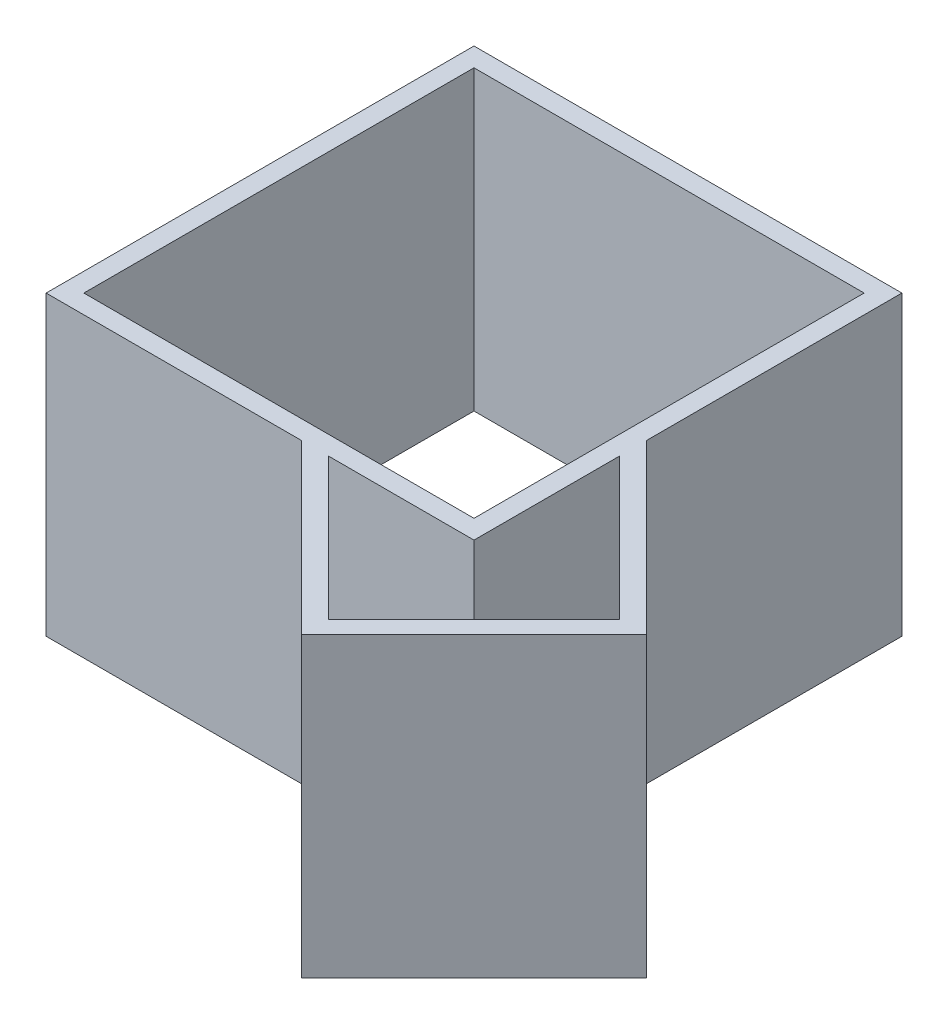
ISO-10303-21;
HEADER;
FILE_DESCRIPTION(('STEP AP214'),'2;1');
FILE_NAME('part.step','',(''),(''),'','','');
FILE_SCHEMA(('AUTOMOTIVE_DESIGN { 1 0 10303 214 1 1 1 1 }'));
ENDSEC;
DATA;
#1=APPLICATION_CONTEXT('core data for automotive mechanical design processes');
#2=APPLICATION_PROTOCOL_DEFINITION('international standard','automotive_design',2000,#1);
#3=PRODUCT_CONTEXT('',#1,'mechanical');
#4=PRODUCT('Part','Part','',(#3));
#5=PRODUCT_RELATED_PRODUCT_CATEGORY('part','',(#4));
#6=PRODUCT_DEFINITION_FORMATION('','',#4);
#7=PRODUCT_DEFINITION_CONTEXT('part definition',#1,'design');
#8=PRODUCT_DEFINITION('design','',#6,#7);
#9=PRODUCT_DEFINITION_SHAPE('','',#8);
#10=(LENGTH_UNIT() NAMED_UNIT(*) SI_UNIT(.MILLI.,.METRE.));
#11=(NAMED_UNIT(*) PLANE_ANGLE_UNIT() SI_UNIT($,.RADIAN.));
#12=(NAMED_UNIT(*) SI_UNIT($,.STERADIAN.) SOLID_ANGLE_UNIT());
#13=UNCERTAINTY_MEASURE_WITH_UNIT(LENGTH_MEASURE(1.E-05),#10,'distance_accuracy_value','');
#14=(GEOMETRIC_REPRESENTATION_CONTEXT(3) GLOBAL_UNCERTAINTY_ASSIGNED_CONTEXT((#13)) GLOBAL_UNIT_ASSIGNED_CONTEXT((#10,
#11,#12)) REPRESENTATION_CONTEXT('',''));
#15=CARTESIAN_POINT('',(0.,0.,0.));
#16=DIRECTION('',(0.,0.,1.));
#17=DIRECTION('',(1.,0.,0.));
#18=AXIS2_PLACEMENT_3D('',#15,#16,#17);
#19=CARTESIAN_POINT('',(35.985,25.,35.985));
#20=DIRECTION('',(-1.,0.,0.));
#21=DIRECTION('',(0.,0.,1.));
#22=AXIS2_PLACEMENT_3D('',#19,#20,#21);
#23=PLANE('',#22);
#24=DIRECTION('',(0.,-1.,0.));
#25=VECTOR('',#24,1.);
#26=CARTESIAN_POINT('',(35.985,25.,11.4837500318861));
#27=LINE('',#26,#25);
#28=CARTESIAN_POINT('',(35.985,25.,11.4837500318861));
#29=VERTEX_POINT('',#28);
#30=CARTESIAN_POINT('',(35.985,-25.,11.4837500318861));
#31=VERTEX_POINT('',#30);
#32=EDGE_CURVE('E55',#29,#31,#27,.T.);
#33=ORIENTED_EDGE('',*,*,#32,.F.);
#34=DIRECTION('',(0.,0.,-1.));
#35=VECTOR('',#34,1.);
#36=CARTESIAN_POINT('',(35.985,25.,35.985));
#37=LINE('',#36,#35);
#38=CARTESIAN_POINT('',(35.985,25.,35.985));
#39=VERTEX_POINT('',#38);
#40=EDGE_CURVE('E154',#39,#29,#37,.T.);
#41=ORIENTED_EDGE('',*,*,#40,.F.);
#42=DIRECTION('',(0.,-1.,0.));
#43=VECTOR('',#42,1.);
#44=CARTESIAN_POINT('',(35.985,25.,35.985));
#45=LINE('',#44,#43);
#46=CARTESIAN_POINT('',(35.985,-25.,35.985));
#47=VERTEX_POINT('',#46);
#48=EDGE_CURVE('E249',#39,#47,#45,.T.);
#49=ORIENTED_EDGE('',*,*,#48,.T.);
#50=DIRECTION('',(0.,0.,-1.));
#51=VECTOR('',#50,1.);
#52=CARTESIAN_POINT('',(35.985,-25.,35.985));
#53=LINE('',#52,#51);
#54=EDGE_CURVE('E250',#47,#31,#53,.T.);
#55=ORIENTED_EDGE('',*,*,#54,.T.);
#56=EDGE_LOOP('',(#33,#41,#49,#55));
#57=FACE_BOUND('',#56,.T.);
#58=ADVANCED_FACE('F33',(#57),#23,.F.);
#59=DIRECTION('',(0.,-1.,0.));
#60=VECTOR('',#59,1.);
#61=CARTESIAN_POINT('',(35.985,25.,6.99362197135155));
#62=LINE('',#61,#60);
#63=CARTESIAN_POINT('',(35.985,25.,6.99362197135155));
#64=VERTEX_POINT('',#63);
#65=CARTESIAN_POINT('',(35.985,-25.,6.99362197135155));
#66=VERTEX_POINT('',#65);
#67=EDGE_CURVE('E180',#64,#66,#62,.T.);
#68=ORIENTED_EDGE('',*,*,#67,.T.);
#69=CARTESIAN_POINT('',(35.985,-25.,-35.985));
#70=VERTEX_POINT('',#69);
#71=EDGE_CURVE('E239',#66,#70,#53,.T.);
#72=ORIENTED_EDGE('',*,*,#71,.T.);
#73=DIRECTION('',(0.,-1.,0.));
#74=VECTOR('',#73,1.);
#75=CARTESIAN_POINT('',(35.985,25.,-35.985));
#76=LINE('',#75,#74);
#77=CARTESIAN_POINT('',(35.985,25.,-35.985));
#78=VERTEX_POINT('',#77);
#79=EDGE_CURVE('E11',#78,#70,#76,.T.);
#80=ORIENTED_EDGE('',*,*,#79,.F.);
#81=EDGE_CURVE('E47',#64,#78,#37,.T.);
#82=ORIENTED_EDGE('',*,*,#81,.F.);
#83=EDGE_LOOP('',(#68,#72,#80,#82));
#84=FACE_BOUND('',#83,.T.);
#85=ADVANCED_FACE('F290',(#84),#23,.F.);
#86=CARTESIAN_POINT('',(-35.985,25.,35.985));
#87=DIRECTION('',(0.,0.,-1.));
#88=DIRECTION('',(-1.,0.,0.));
#89=AXIS2_PLACEMENT_3D('',#86,#87,#88);
#90=PLANE('',#89);
#91=DIRECTION('',(0.,-1.,0.));
#92=VECTOR('',#91,1.);
#93=CARTESIAN_POINT('',(11.4837500318861,25.,35.985));
#94=LINE('',#93,#92);
#95=CARTESIAN_POINT('',(11.4837500318861,25.,35.985));
#96=VERTEX_POINT('',#95);
#97=CARTESIAN_POINT('',(11.4837500318861,-25.,35.985));
#98=VERTEX_POINT('',#97);
#99=EDGE_CURVE('E203',#96,#98,#94,.T.);
#100=ORIENTED_EDGE('',*,*,#99,.T.);
#101=DIRECTION('',(1.,0.,0.));
#102=VECTOR('',#101,1.);
#103=CARTESIAN_POINT('',(-35.985,-25.,35.985));
#104=LINE('',#103,#102);
#105=EDGE_CURVE('E256',#98,#47,#104,.T.);
#106=ORIENTED_EDGE('',*,*,#105,.T.);
#107=ORIENTED_EDGE('',*,*,#48,.F.);
#108=DIRECTION('',(1.,0.,0.));
#109=VECTOR('',#108,1.);
#110=CARTESIAN_POINT('',(-35.985,25.,35.985));
#111=LINE('',#110,#109);
#112=EDGE_CURVE('E245',#96,#39,#111,.T.);
#113=ORIENTED_EDGE('',*,*,#112,.F.);
#114=EDGE_LOOP('',(#100,#106,#107,#113));
#115=FACE_BOUND('',#114,.T.);
#116=ADVANCED_FACE('F311',(#115),#90,.F.);
#117=DIRECTION('',(0.,-1.,0.));
#118=VECTOR('',#117,1.);
#119=CARTESIAN_POINT('',(6.99362197135154,25.,35.985));
#120=LINE('',#119,#118);
#121=CARTESIAN_POINT('',(6.99362197135155,25.,35.985));
#122=VERTEX_POINT('',#121);
#123=CARTESIAN_POINT('',(6.99362197135155,-25.,35.985));
#124=VERTEX_POINT('',#123);
#125=EDGE_CURVE('E200',#122,#124,#120,.T.);
#126=ORIENTED_EDGE('',*,*,#125,.F.);
#127=CARTESIAN_POINT('',(-35.985,25.,35.985));
#128=VERTEX_POINT('',#127);
#129=EDGE_CURVE('E246',#128,#122,#111,.T.);
#130=ORIENTED_EDGE('',*,*,#129,.F.);
#131=DIRECTION('',(0.,-1.,0.));
#132=VECTOR('',#131,1.);
#133=CARTESIAN_POINT('',(-35.985,25.,35.985));
#134=LINE('',#133,#132);
#135=CARTESIAN_POINT('',(-35.985,-25.,35.985));
#136=VERTEX_POINT('',#135);
#137=EDGE_CURVE('E261',#128,#136,#134,.T.);
#138=ORIENTED_EDGE('',*,*,#137,.T.);
#139=EDGE_CURVE('E257',#136,#124,#104,.T.);
#140=ORIENTED_EDGE('',*,*,#139,.T.);
#141=EDGE_LOOP('',(#126,#130,#138,#140));
#142=FACE_BOUND('',#141,.T.);
#143=ADVANCED_FACE('F280',(#142),#90,.F.);
#144=CARTESIAN_POINT('',(0.,25.,0.));
#145=DIRECTION('',(0.,-1.,0.));
#146=DIRECTION('',(0.,0.,-1.));
#147=AXIS2_PLACEMENT_3D('',#144,#145,#146);
#148=PLANE('',#147);
#149=ORIENTED_EDGE('',*,*,#40,.T.);
#150=DIRECTION('',(0.707106781186548,0.,0.707106781186547));
#151=VECTOR('',#150,1.);
#152=CARTESIAN_POINT('',(35.985,25.,11.4837500318861));
#153=LINE('',#152,#151);
#154=CARTESIAN_POINT('',(59.7791431869273,25.,35.2778932188135));
#155=VERTEX_POINT('',#154);
#156=EDGE_CURVE('E146',#29,#155,#153,.T.);
#157=ORIENTED_EDGE('',*,*,#156,.T.);
#158=DIRECTION('',(-0.707106781186548,0.,0.707106781186547));
#159=VECTOR('',#158,1.);
#160=CARTESIAN_POINT('',(35.2778932188135,25.,59.7791431869273));
#161=LINE('',#160,#159);
#162=CARTESIAN_POINT('',(35.2778932188135,25.,59.7791431869273));
#163=VERTEX_POINT('',#162);
#164=EDGE_CURVE('E152',#155,#163,#161,.T.);
#165=ORIENTED_EDGE('',*,*,#164,.T.);
#166=DIRECTION('',(-0.707106781186547,0.,-0.707106781186547));
#167=VECTOR('',#166,1.);
#168=CARTESIAN_POINT('',(11.4837500318861,25.,35.985));
#169=LINE('',#168,#167);
#170=EDGE_CURVE('E170',#163,#96,#169,.T.);
#171=ORIENTED_EDGE('',*,*,#170,.T.);
#172=ORIENTED_EDGE('',*,*,#112,.T.);
#173=EDGE_LOOP('',(#149,#157,#165,#171,#172));
#174=FACE_BOUND('',#173,.T.);
#175=DIRECTION('',(-0.707106781186548,0.,-0.707106781186547));
#176=VECTOR('',#175,1.);
#177=CARTESIAN_POINT('',(64.2692712474619,25.,35.2778932188134));
#178=LINE('',#177,#176);
#179=CARTESIAN_POINT('',(64.2692712474619,25.,35.2778932188134));
#180=VERTEX_POINT('',#179);
#181=EDGE_CURVE('E178',#180,#64,#178,.T.);
#182=ORIENTED_EDGE('',*,*,#181,.T.);
#183=ORIENTED_EDGE('',*,*,#81,.T.);
#184=DIRECTION('',(-1.,0.,0.));
#185=VECTOR('',#184,1.);
#186=CARTESIAN_POINT('',(-35.985,25.,-35.985));
#187=LINE('',#186,#185);
#188=CARTESIAN_POINT('',(-35.985,25.,-35.985));
#189=VERTEX_POINT('',#188);
#190=EDGE_CURVE('E241',#78,#189,#187,.T.);
#191=ORIENTED_EDGE('',*,*,#190,.T.);
#192=DIRECTION('',(0.,0.,1.));
#193=VECTOR('',#192,1.);
#194=CARTESIAN_POINT('',(-35.985,25.,35.985));
#195=LINE('',#194,#193);
#196=EDGE_CURVE('E243',#189,#128,#195,.T.);
#197=ORIENTED_EDGE('',*,*,#196,.T.);
#198=ORIENTED_EDGE('',*,*,#129,.T.);
#199=DIRECTION('',(0.707106781186548,0.,0.707106781186548));
#200=VECTOR('',#199,1.);
#201=CARTESIAN_POINT('',(35.2778932188135,25.,64.2692712474619));
#202=LINE('',#201,#200);
#203=CARTESIAN_POINT('',(35.2778932188135,25.,64.2692712474619));
#204=VERTEX_POINT('',#203);
#205=EDGE_CURVE('E172',#122,#204,#202,.T.);
#206=ORIENTED_EDGE('',*,*,#205,.T.);
#207=DIRECTION('',(0.707106781186547,0.,-0.707106781186548));
#208=VECTOR('',#207,1.);
#209=CARTESIAN_POINT('',(35.2778932188135,25.,64.2692712474619));
#210=LINE('',#209,#208);
#211=EDGE_CURVE('E176',#204,#180,#210,.T.);
#212=ORIENTED_EDGE('',*,*,#211,.T.);
#213=EDGE_LOOP('',(#182,#183,#191,#197,#198,#206,#212));
#214=FACE_BOUND('',#213,.T.);
#215=DIRECTION('',(0.,0.,-1.));
#216=VECTOR('',#215,1.);
#217=CARTESIAN_POINT('',(32.81,25.,32.81));
#218=LINE('',#217,#216);
#219=CARTESIAN_POINT('',(32.81,25.,32.81));
#220=VERTEX_POINT('',#219);
#221=CARTESIAN_POINT('',(32.81,25.,-32.81));
#222=VERTEX_POINT('',#221);
#223=EDGE_CURVE('E209',#220,#222,#218,.T.);
#224=ORIENTED_EDGE('',*,*,#223,.F.);
#225=DIRECTION('',(1.,0.,0.));
#226=VECTOR('',#225,1.);
#227=CARTESIAN_POINT('',(-32.81,25.,32.81));
#228=LINE('',#227,#226);
#229=CARTESIAN_POINT('',(-32.81,25.,32.81));
#230=VERTEX_POINT('',#229);
#231=EDGE_CURVE('E217',#230,#220,#228,.T.);
#232=ORIENTED_EDGE('',*,*,#231,.F.);
#233=DIRECTION('',(0.,0.,1.));
#234=VECTOR('',#233,1.);
#235=CARTESIAN_POINT('',(-32.81,25.,32.81));
#236=LINE('',#235,#234);
#237=CARTESIAN_POINT('',(-32.81,25.,-32.81));
#238=VERTEX_POINT('',#237);
#239=EDGE_CURVE('E214',#238,#230,#236,.T.);
#240=ORIENTED_EDGE('',*,*,#239,.F.);
#241=DIRECTION('',(-1.,0.,0.));
#242=VECTOR('',#241,1.);
#243=CARTESIAN_POINT('',(-32.81,25.,-32.81));
#244=LINE('',#243,#242);
#245=EDGE_CURVE('E211',#222,#238,#244,.T.);
#246=ORIENTED_EDGE('',*,*,#245,.F.);
#247=EDGE_LOOP('',(#224,#232,#240,#246));
#248=FACE_BOUND('',#247,.T.);
#249=ADVANCED_FACE('F148',(#174,#214,#248),#148,.F.);
#250=CARTESIAN_POINT('',(0.,-25.,0.));
#251=DIRECTION('',(0.,-1.,0.));
#252=DIRECTION('',(0.,0.,-1.));
#253=AXIS2_PLACEMENT_3D('',#250,#251,#252);
#254=PLANE('',#253);
#255=DIRECTION('',(0.707106781186548,0.,0.707106781186547));
#256=VECTOR('',#255,1.);
#257=CARTESIAN_POINT('',(35.985,-25.,11.4837500318861));
#258=LINE('',#257,#256);
#259=CARTESIAN_POINT('',(59.7791431869273,-25.,35.2778932188135));
#260=VERTEX_POINT('',#259);
#261=EDGE_CURVE('E162',#31,#260,#258,.T.);
#262=ORIENTED_EDGE('',*,*,#261,.F.);
#263=ORIENTED_EDGE('',*,*,#54,.F.);
#264=ORIENTED_EDGE('',*,*,#105,.F.);
#265=DIRECTION('',(-0.707106781186547,0.,-0.707106781186547));
#266=VECTOR('',#265,1.);
#267=CARTESIAN_POINT('',(11.4837500318861,-25.,35.985));
#268=LINE('',#267,#266);
#269=CARTESIAN_POINT('',(35.2778932188135,-25.,59.7791431869273));
#270=VERTEX_POINT('',#269);
#271=EDGE_CURVE('E184',#270,#98,#268,.T.);
#272=ORIENTED_EDGE('',*,*,#271,.F.);
#273=DIRECTION('',(-0.707106781186548,0.,0.707106781186547));
#274=VECTOR('',#273,1.);
#275=CARTESIAN_POINT('',(35.2778932188135,-25.,59.7791431869273));
#276=LINE('',#275,#274);
#277=EDGE_CURVE('E182',#260,#270,#276,.T.);
#278=ORIENTED_EDGE('',*,*,#277,.F.);
#279=EDGE_LOOP('',(#262,#263,#264,#272,#278));
#280=FACE_BOUND('',#279,.T.);
#281=ORIENTED_EDGE('',*,*,#71,.F.);
#282=DIRECTION('',(-0.707106781186548,0.,-0.707106781186547));
#283=VECTOR('',#282,1.);
#284=CARTESIAN_POINT('',(64.2692712474619,-25.,35.2778932188134));
#285=LINE('',#284,#283);
#286=CARTESIAN_POINT('',(64.2692712474619,-25.,35.2778932188134));
#287=VERTEX_POINT('',#286);
#288=EDGE_CURVE('E156',#287,#66,#285,.T.);
#289=ORIENTED_EDGE('',*,*,#288,.F.);
#290=DIRECTION('',(0.707106781186547,0.,-0.707106781186548));
#291=VECTOR('',#290,1.);
#292=CARTESIAN_POINT('',(35.2778932188135,-25.,64.2692712474619));
#293=LINE('',#292,#291);
#294=CARTESIAN_POINT('',(35.2778932188135,-25.,64.2692712474619));
#295=VERTEX_POINT('',#294);
#296=EDGE_CURVE('E189',#295,#287,#293,.T.);
#297=ORIENTED_EDGE('',*,*,#296,.F.);
#298=DIRECTION('',(0.707106781186548,0.,0.707106781186548));
#299=VECTOR('',#298,1.);
#300=CARTESIAN_POINT('',(35.2778932188135,-25.,64.2692712474619));
#301=LINE('',#300,#299);
#302=EDGE_CURVE('E187',#124,#295,#301,.T.);
#303=ORIENTED_EDGE('',*,*,#302,.F.);
#304=ORIENTED_EDGE('',*,*,#139,.F.);
#305=DIRECTION('',(0.,0.,1.));
#306=VECTOR('',#305,1.);
#307=CARTESIAN_POINT('',(-35.985,-25.,35.985));
#308=LINE('',#307,#306);
#309=CARTESIAN_POINT('',(-35.985,-25.,-35.985));
#310=VERTEX_POINT('',#309);
#311=EDGE_CURVE('E254',#310,#136,#308,.T.);
#312=ORIENTED_EDGE('',*,*,#311,.F.);
#313=DIRECTION('',(-1.,0.,0.));
#314=VECTOR('',#313,1.);
#315=CARTESIAN_POINT('',(-35.985,-25.,-35.985));
#316=LINE('',#315,#314);
#317=EDGE_CURVE('E252',#70,#310,#316,.T.);
#318=ORIENTED_EDGE('',*,*,#317,.F.);
#319=EDGE_LOOP('',(#281,#289,#297,#303,#304,#312,#318));
#320=FACE_BOUND('',#319,.T.);
#321=DIRECTION('',(1.,0.,0.));
#322=VECTOR('',#321,1.);
#323=CARTESIAN_POINT('',(-32.81,-25.,32.81));
#324=LINE('',#323,#322);
#325=CARTESIAN_POINT('',(-32.81,-25.,32.81));
#326=VERTEX_POINT('',#325);
#327=CARTESIAN_POINT('',(32.81,-25.,32.81));
#328=VERTEX_POINT('',#327);
#329=EDGE_CURVE('E212',#326,#328,#324,.T.);
#330=ORIENTED_EDGE('',*,*,#329,.T.);
#331=DIRECTION('',(0.,0.,-1.));
#332=VECTOR('',#331,1.);
#333=CARTESIAN_POINT('',(32.81,-25.,32.81));
#334=LINE('',#333,#332);
#335=CARTESIAN_POINT('',(32.81,-25.,-32.81));
#336=VERTEX_POINT('',#335);
#337=EDGE_CURVE('E208',#328,#336,#334,.T.);
#338=ORIENTED_EDGE('',*,*,#337,.T.);
#339=DIRECTION('',(-1.,0.,0.));
#340=VECTOR('',#339,1.);
#341=CARTESIAN_POINT('',(-32.81,-25.,-32.81));
#342=LINE('',#341,#340);
#343=CARTESIAN_POINT('',(-32.81,-25.,-32.81));
#344=VERTEX_POINT('',#343);
#345=EDGE_CURVE('E222',#336,#344,#342,.T.);
#346=ORIENTED_EDGE('',*,*,#345,.T.);
#347=DIRECTION('',(0.,0.,1.));
#348=VECTOR('',#347,1.);
#349=CARTESIAN_POINT('',(-32.81,-25.,32.81));
#350=LINE('',#349,#348);
#351=EDGE_CURVE('E225',#344,#326,#350,.T.);
#352=ORIENTED_EDGE('',*,*,#351,.T.);
#353=EDGE_LOOP('',(#330,#338,#346,#352));
#354=FACE_BOUND('',#353,.T.);
#355=ADVANCED_FACE('F275',(#280,#320,#354),#254,.T.);
#356=CARTESIAN_POINT('',(-35.985,25.,-35.985));
#357=DIRECTION('',(0.,0.,1.));
#358=DIRECTION('',(1.,0.,0.));
#359=AXIS2_PLACEMENT_3D('',#356,#357,#358);
#360=PLANE('',#359);
#361=ORIENTED_EDGE('',*,*,#317,.T.);
#362=DIRECTION('',(0.,-1.,0.));
#363=VECTOR('',#362,1.);
#364=CARTESIAN_POINT('',(-35.985,25.,-35.985));
#365=LINE('',#364,#363);
#366=EDGE_CURVE('E40',#189,#310,#365,.T.);
#367=ORIENTED_EDGE('',*,*,#366,.F.);
#368=ORIENTED_EDGE('',*,*,#190,.F.);
#369=ORIENTED_EDGE('',*,*,#79,.T.);
#370=EDGE_LOOP('',(#361,#367,#368,#369));
#371=FACE_BOUND('',#370,.T.);
#372=ADVANCED_FACE('F289',(#371),#360,.F.);
#373=CARTESIAN_POINT('',(-35.985,25.,35.985));
#374=DIRECTION('',(1.,0.,0.));
#375=DIRECTION('',(0.,0.,-1.));
#376=AXIS2_PLACEMENT_3D('',#373,#374,#375);
#377=PLANE('',#376);
#378=ORIENTED_EDGE('',*,*,#311,.T.);
#379=ORIENTED_EDGE('',*,*,#137,.F.);
#380=ORIENTED_EDGE('',*,*,#196,.F.);
#381=ORIENTED_EDGE('',*,*,#366,.T.);
#382=EDGE_LOOP('',(#378,#379,#380,#381));
#383=FACE_BOUND('',#382,.T.);
#384=ADVANCED_FACE('F268',(#383),#377,.F.);
#385=CARTESIAN_POINT('',(32.81,25.,32.81));
#386=DIRECTION('',(-1.,0.,0.));
#387=DIRECTION('',(0.,0.,1.));
#388=AXIS2_PLACEMENT_3D('',#385,#386,#387);
#389=PLANE('',#388);
#390=ORIENTED_EDGE('',*,*,#337,.F.);
#391=DIRECTION('',(0.,-1.,0.));
#392=VECTOR('',#391,1.);
#393=CARTESIAN_POINT('',(32.81,25.,32.81));
#394=LINE('',#393,#392);
#395=EDGE_CURVE('E219',#220,#328,#394,.T.);
#396=ORIENTED_EDGE('',*,*,#395,.F.);
#397=ORIENTED_EDGE('',*,*,#223,.T.);
#398=DIRECTION('',(0.,-1.,0.));
#399=VECTOR('',#398,1.);
#400=CARTESIAN_POINT('',(32.81,25.,-32.81));
#401=LINE('',#400,#399);
#402=EDGE_CURVE('E236',#222,#336,#401,.T.);
#403=ORIENTED_EDGE('',*,*,#402,.T.);
#404=EDGE_LOOP('',(#390,#396,#397,#403));
#405=FACE_BOUND('',#404,.T.);
#406=ADVANCED_FACE('F324',(#405),#389,.T.);
#407=CARTESIAN_POINT('',(-32.81,25.,-32.81));
#408=DIRECTION('',(0.,0.,1.));
#409=DIRECTION('',(1.,0.,0.));
#410=AXIS2_PLACEMENT_3D('',#407,#408,#409);
#411=PLANE('',#410);
#412=ORIENTED_EDGE('',*,*,#345,.F.);
#413=ORIENTED_EDGE('',*,*,#402,.F.);
#414=ORIENTED_EDGE('',*,*,#245,.T.);
#415=DIRECTION('',(0.,-1.,0.));
#416=VECTOR('',#415,1.);
#417=CARTESIAN_POINT('',(-32.81,25.,-32.81));
#418=LINE('',#417,#416);
#419=EDGE_CURVE('E234',#238,#344,#418,.T.);
#420=ORIENTED_EDGE('',*,*,#419,.T.);
#421=EDGE_LOOP('',(#412,#413,#414,#420));
#422=FACE_BOUND('',#421,.T.);
#423=ADVANCED_FACE('F354',(#422),#411,.T.);
#424=CARTESIAN_POINT('',(-32.81,25.,32.81));
#425=DIRECTION('',(1.,0.,0.));
#426=DIRECTION('',(0.,0.,-1.));
#427=AXIS2_PLACEMENT_3D('',#424,#425,#426);
#428=PLANE('',#427);
#429=ORIENTED_EDGE('',*,*,#351,.F.);
#430=ORIENTED_EDGE('',*,*,#419,.F.);
#431=ORIENTED_EDGE('',*,*,#239,.T.);
#432=DIRECTION('',(0.,-1.,0.));
#433=VECTOR('',#432,1.);
#434=CARTESIAN_POINT('',(-32.81,25.,32.81));
#435=LINE('',#434,#433);
#436=EDGE_CURVE('E232',#230,#326,#435,.T.);
#437=ORIENTED_EDGE('',*,*,#436,.T.);
#438=EDGE_LOOP('',(#429,#430,#431,#437));
#439=FACE_BOUND('',#438,.T.);
#440=ADVANCED_FACE('F350',(#439),#428,.T.);
#441=CARTESIAN_POINT('',(-32.81,25.,32.81));
#442=DIRECTION('',(0.,0.,-1.));
#443=DIRECTION('',(-1.,0.,0.));
#444=AXIS2_PLACEMENT_3D('',#441,#442,#443);
#445=PLANE('',#444);
#446=ORIENTED_EDGE('',*,*,#329,.F.);
#447=ORIENTED_EDGE('',*,*,#436,.F.);
#448=ORIENTED_EDGE('',*,*,#231,.T.);
#449=ORIENTED_EDGE('',*,*,#395,.T.);
#450=EDGE_LOOP('',(#446,#447,#448,#449));
#451=FACE_BOUND('',#450,.T.);
#452=ADVANCED_FACE('F347',(#451),#445,.T.);
#453=CARTESIAN_POINT('',(35.985,25.,11.4837500318861));
#454=DIRECTION('',(0.707106781186547,0.,-0.707106781186548));
#455=DIRECTION('',(-0.707106781186548,0.,-0.707106781186547));
#456=AXIS2_PLACEMENT_3D('',#453,#454,#455);
#457=PLANE('',#456);
#458=ORIENTED_EDGE('',*,*,#261,.T.);
#459=DIRECTION('',(0.,-1.,0.));
#460=VECTOR('',#459,1.);
#461=CARTESIAN_POINT('',(59.7791431869273,25.,35.2778932188135));
#462=LINE('',#461,#460);
#463=EDGE_CURVE('E159',#155,#260,#462,.T.);
#464=ORIENTED_EDGE('',*,*,#463,.F.);
#465=ORIENTED_EDGE('',*,*,#156,.F.);
#466=ORIENTED_EDGE('',*,*,#32,.T.);
#467=EDGE_LOOP('',(#458,#464,#465,#466));
#468=FACE_BOUND('',#467,.T.);
#469=ADVANCED_FACE('F160',(#468),#457,.F.);
#470=CARTESIAN_POINT('',(35.2778932188135,25.,59.7791431869273));
#471=DIRECTION('',(0.707106781186547,0.,0.707106781186548));
#472=DIRECTION('',(0.707106781186548,0.,-0.707106781186547));
#473=AXIS2_PLACEMENT_3D('',#470,#471,#472);
#474=PLANE('',#473);
#475=ORIENTED_EDGE('',*,*,#277,.T.);
#476=DIRECTION('',(0.,-1.,0.));
#477=VECTOR('',#476,1.);
#478=CARTESIAN_POINT('',(35.2778932188135,25.,59.7791431869273));
#479=LINE('',#478,#477);
#480=EDGE_CURVE('E165',#163,#270,#479,.T.);
#481=ORIENTED_EDGE('',*,*,#480,.F.);
#482=ORIENTED_EDGE('',*,*,#164,.F.);
#483=ORIENTED_EDGE('',*,*,#463,.T.);
#484=EDGE_LOOP('',(#475,#481,#482,#483));
#485=FACE_BOUND('',#484,.T.);
#486=ADVANCED_FACE('F167',(#485),#474,.F.);
#487=CARTESIAN_POINT('',(11.4837500318861,25.,35.985));
#488=DIRECTION('',(-0.707106781186547,0.,0.707106781186547));
#489=DIRECTION('',(0.707106781186548,0.,0.707106781186548));
#490=AXIS2_PLACEMENT_3D('',#487,#488,#489);
#491=PLANE('',#490);
#492=ORIENTED_EDGE('',*,*,#271,.T.);
#493=ORIENTED_EDGE('',*,*,#99,.F.);
#494=ORIENTED_EDGE('',*,*,#170,.F.);
#495=ORIENTED_EDGE('',*,*,#480,.T.);
#496=EDGE_LOOP('',(#492,#493,#494,#495));
#497=FACE_BOUND('',#496,.T.);
#498=ADVANCED_FACE('F305',(#497),#491,.F.);
#499=CARTESIAN_POINT('',(35.2778932188135,25.,64.2692712474619));
#500=DIRECTION('',(0.707106781186548,0.,-0.707106781186548));
#501=DIRECTION('',(-0.707106781186548,0.,-0.707106781186548));
#502=AXIS2_PLACEMENT_3D('',#499,#500,#501);
#503=PLANE('',#502);
#504=ORIENTED_EDGE('',*,*,#302,.T.);
#505=DIRECTION('',(0.,-1.,0.));
#506=VECTOR('',#505,1.);
#507=CARTESIAN_POINT('',(35.2778932188135,25.,64.2692712474619));
#508=LINE('',#507,#506);
#509=EDGE_CURVE('E197',#204,#295,#508,.T.);
#510=ORIENTED_EDGE('',*,*,#509,.F.);
#511=ORIENTED_EDGE('',*,*,#205,.F.);
#512=ORIENTED_EDGE('',*,*,#125,.T.);
#513=EDGE_LOOP('',(#504,#510,#511,#512));
#514=FACE_BOUND('',#513,.T.);
#515=ADVANCED_FACE('F284',(#514),#503,.F.);
#516=CARTESIAN_POINT('',(35.2778932188135,25.,64.2692712474619));
#517=DIRECTION('',(-0.707106781186548,0.,-0.707106781186547));
#518=DIRECTION('',(-0.707106781186547,0.,0.707106781186548));
#519=AXIS2_PLACEMENT_3D('',#516,#517,#518);
#520=PLANE('',#519);
#521=ORIENTED_EDGE('',*,*,#296,.T.);
#522=DIRECTION('',(0.,-1.,0.));
#523=VECTOR('',#522,1.);
#524=CARTESIAN_POINT('',(64.2692712474619,25.,35.2778932188134));
#525=LINE('',#524,#523);
#526=EDGE_CURVE('E194',#180,#287,#525,.T.);
#527=ORIENTED_EDGE('',*,*,#526,.F.);
#528=ORIENTED_EDGE('',*,*,#211,.F.);
#529=ORIENTED_EDGE('',*,*,#509,.T.);
#530=EDGE_LOOP('',(#521,#527,#528,#529));
#531=FACE_BOUND('',#530,.T.);
#532=ADVANCED_FACE('F297',(#531),#520,.F.);
#533=CARTESIAN_POINT('',(64.2692712474619,25.,35.2778932188134));
#534=DIRECTION('',(-0.707106781186547,0.,0.707106781186548));
#535=DIRECTION('',(0.707106781186548,0.,0.707106781186547));
#536=AXIS2_PLACEMENT_3D('',#533,#534,#535);
#537=PLANE('',#536);
#538=ORIENTED_EDGE('',*,*,#288,.T.);
#539=ORIENTED_EDGE('',*,*,#67,.F.);
#540=ORIENTED_EDGE('',*,*,#181,.F.);
#541=ORIENTED_EDGE('',*,*,#526,.T.);
#542=EDGE_LOOP('',(#538,#539,#540,#541));
#543=FACE_BOUND('',#542,.T.);
#544=ADVANCED_FACE('F294',(#543),#537,.F.);
#545=CLOSED_SHELL('',(#58,#85,#116,#143,#249,#355,#372,#384,#406,#423,#440,#452,#469,#486,#498,
#515,#532,#544));
#546=MANIFOLD_SOLID_BREP('B2',#545);
#547=ADVANCED_BREP_SHAPE_REPRESENTATION('',(#18,#546),#14);
#548=SHAPE_DEFINITION_REPRESENTATION(#9,#547);
ENDSEC;
END-ISO-10303-21;
